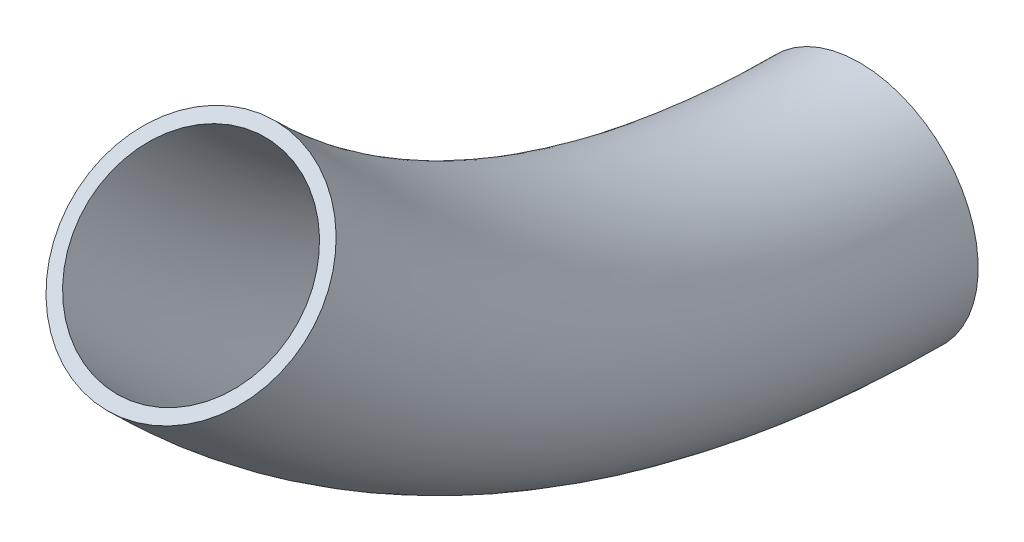
ISO-10303-21;
HEADER;
FILE_DESCRIPTION(('STEP AP214'),'2;1');
FILE_NAME('part.step','',(''),(''),'','','');
FILE_SCHEMA(('AUTOMOTIVE_DESIGN { 1 0 10303 214 1 1 1 1 }'));
ENDSEC;
DATA;
#1=APPLICATION_CONTEXT('core data for automotive mechanical design processes');
#2=APPLICATION_PROTOCOL_DEFINITION('international standard','automotive_design',2000,#1);
#3=PRODUCT_CONTEXT('',#1,'mechanical');
#4=PRODUCT('Part','Part','',(#3));
#5=PRODUCT_RELATED_PRODUCT_CATEGORY('part','',(#4));
#6=PRODUCT_DEFINITION_FORMATION('','',#4);
#7=PRODUCT_DEFINITION_CONTEXT('part definition',#1,'design');
#8=PRODUCT_DEFINITION('design','',#6,#7);
#9=PRODUCT_DEFINITION_SHAPE('','',#8);
#10=(LENGTH_UNIT() NAMED_UNIT(*) SI_UNIT(.MILLI.,.METRE.));
#11=(NAMED_UNIT(*) PLANE_ANGLE_UNIT() SI_UNIT($,.RADIAN.));
#12=(NAMED_UNIT(*) SI_UNIT($,.STERADIAN.) SOLID_ANGLE_UNIT());
#13=UNCERTAINTY_MEASURE_WITH_UNIT(LENGTH_MEASURE(1.E-05),#10,'distance_accuracy_value','');
#14=(GEOMETRIC_REPRESENTATION_CONTEXT(3) GLOBAL_UNCERTAINTY_ASSIGNED_CONTEXT((#13)) GLOBAL_UNIT_ASSIGNED_CONTEXT((#10,
#11,#12)) REPRESENTATION_CONTEXT('',''));
#15=CARTESIAN_POINT('',(0.,0.,0.));
#16=DIRECTION('',(0.,0.,1.));
#17=DIRECTION('',(1.,0.,0.));
#18=AXIS2_PLACEMENT_3D('',#15,#16,#17);
#19=CARTESIAN_POINT('',(0.,139.7,0.));
#20=DIRECTION('',(1.,0.,0.));
#21=DIRECTION('',(0.,0.,-1.));
#22=AXIS2_PLACEMENT_3D('',#19,#20,#21);
#23=TOROIDAL_SURFACE('',#22,139.7,15.5);
#24=CARTESIAN_POINT('',(0.,40.9171826682395,98.7828173317609));
#25=DIRECTION('',(0.,0.707106781186549,0.707106781186546));
#26=DIRECTION('',(1.,0.,0.));
#27=AXIS2_PLACEMENT_3D('',#24,#25,#26);
#28=CIRCLE('',#27,15.5);
#29=CARTESIAN_POINT('',(0.,29.957027559848,109.742972440152));
#30=VERTEX_POINT('',#29);
#31=EDGE_CURVE('E41',#30,#30,#28,.T.);
#32=CARTESIAN_POINT('',(0.,0.,0.));
#33=DIRECTION('',(0.,0.,1.));
#34=DIRECTION('',(1.,0.,0.));
#35=AXIS2_PLACEMENT_3D('',#32,#33,#34);
#36=CIRCLE('',#35,15.5);
#37=CARTESIAN_POINT('',(0.,-15.5,0.));
#38=VERTEX_POINT('',#37);
#39=EDGE_CURVE('E49',#38,#38,#36,.T.);
#40=CARTESIAN_POINT('',(0.,139.7,0.));
#41=DIRECTION('',(1.,0.,0.));
#42=DIRECTION('',(0.,0.,-1.));
#43=AXIS2_PLACEMENT_3D('',#40,#41,#42);
#44=CIRCLE('',#43,155.2);
#45=EDGE_CURVE('',#30,#38,#44,.T.);
#46=ORIENTED_EDGE('',*,*,#31,.T.);
#47=ORIENTED_EDGE('',*,*,#39,.F.);
#48=ORIENTED_EDGE('',*,*,#45,.T.);
#49=ORIENTED_EDGE('',*,*,#45,.F.);
#50=EDGE_LOOP('',(#46,#48,#47,#49));
#51=FACE_BOUND('',#50,.T.);
#52=ADVANCED_FACE('F34',(#51),#23,.F.);
#53=CARTESIAN_POINT('',(0.,139.7,0.));
#54=DIRECTION('',(1.,0.,0.));
#55=DIRECTION('',(0.,0.,-1.));
#56=AXIS2_PLACEMENT_3D('',#53,#54,#55);
#57=TOROIDAL_SURFACE('',#56,139.7,17.5);
#58=CARTESIAN_POINT('',(0.,40.9171826682395,98.7828173317609));
#59=DIRECTION('',(0.,0.707106781186549,0.707106781186546));
#60=DIRECTION('',(1.,0.,0.));
#61=AXIS2_PLACEMENT_3D('',#58,#59,#60);
#62=CIRCLE('',#61,17.5);
#63=CARTESIAN_POINT('',(0.,28.5428139974749,111.157186002525));
#64=VERTEX_POINT('',#63);
#65=EDGE_CURVE('E10',#64,#64,#62,.T.);
#66=CARTESIAN_POINT('',(0.,0.,0.));
#67=DIRECTION('',(0.,0.,1.));
#68=DIRECTION('',(1.,0.,0.));
#69=AXIS2_PLACEMENT_3D('',#66,#67,#68);
#70=CIRCLE('',#69,17.5);
#71=CARTESIAN_POINT('',(0.,-17.5,0.));
#72=VERTEX_POINT('',#71);
#73=EDGE_CURVE('E45',#72,#72,#70,.T.);
#74=CARTESIAN_POINT('',(0.,139.7,0.));
#75=DIRECTION('',(1.,0.,0.));
#76=DIRECTION('',(0.,0.,-1.));
#77=AXIS2_PLACEMENT_3D('',#74,#75,#76);
#78=CIRCLE('',#77,157.2);
#79=EDGE_CURVE('',#64,#72,#78,.T.);
#80=ORIENTED_EDGE('',*,*,#65,.F.);
#81=ORIENTED_EDGE('',*,*,#73,.T.);
#82=ORIENTED_EDGE('',*,*,#79,.T.);
#83=ORIENTED_EDGE('',*,*,#79,.F.);
#84=EDGE_LOOP('',(#80,#82,#81,#83));
#85=FACE_BOUND('',#84,.T.);
#86=ADVANCED_FACE('F36',(#85),#57,.T.);
#87=CARTESIAN_POINT('',(0.,40.9171826682395,98.7828173317609));
#88=DIRECTION('',(0.,0.707106781186549,0.707106781186546));
#89=DIRECTION('',(1.,0.,0.));
#90=AXIS2_PLACEMENT_3D('',#87,#88,#89);
#91=PLANE('',#90);
#92=ORIENTED_EDGE('',*,*,#31,.F.);
#93=EDGE_LOOP('',(#92));
#94=FACE_BOUND('',#93,.T.);
#95=ORIENTED_EDGE('',*,*,#65,.T.);
#96=EDGE_LOOP('',(#95));
#97=FACE_BOUND('',#96,.T.);
#98=ADVANCED_FACE('F59',(#94,#97),#91,.T.);
#99=CARTESIAN_POINT('',(0.,0.,0.));
#100=DIRECTION('',(0.,0.,1.));
#101=DIRECTION('',(1.,0.,0.));
#102=AXIS2_PLACEMENT_3D('',#99,#100,#101);
#103=PLANE('',#102);
#104=ORIENTED_EDGE('',*,*,#39,.T.);
#105=EDGE_LOOP('',(#104));
#106=FACE_BOUND('',#105,.T.);
#107=ORIENTED_EDGE('',*,*,#73,.F.);
#108=EDGE_LOOP('',(#107));
#109=FACE_BOUND('',#108,.T.);
#110=ADVANCED_FACE('F55',(#106,#109),#103,.F.);
#111=CLOSED_SHELL('',(#52,#86,#98,#110));
#112=MANIFOLD_SOLID_BREP('B2',#111);
#113=ADVANCED_BREP_SHAPE_REPRESENTATION('',(#18,#112),#14);
#114=SHAPE_DEFINITION_REPRESENTATION(#9,#113);
ENDSEC;
END-ISO-10303-21;
